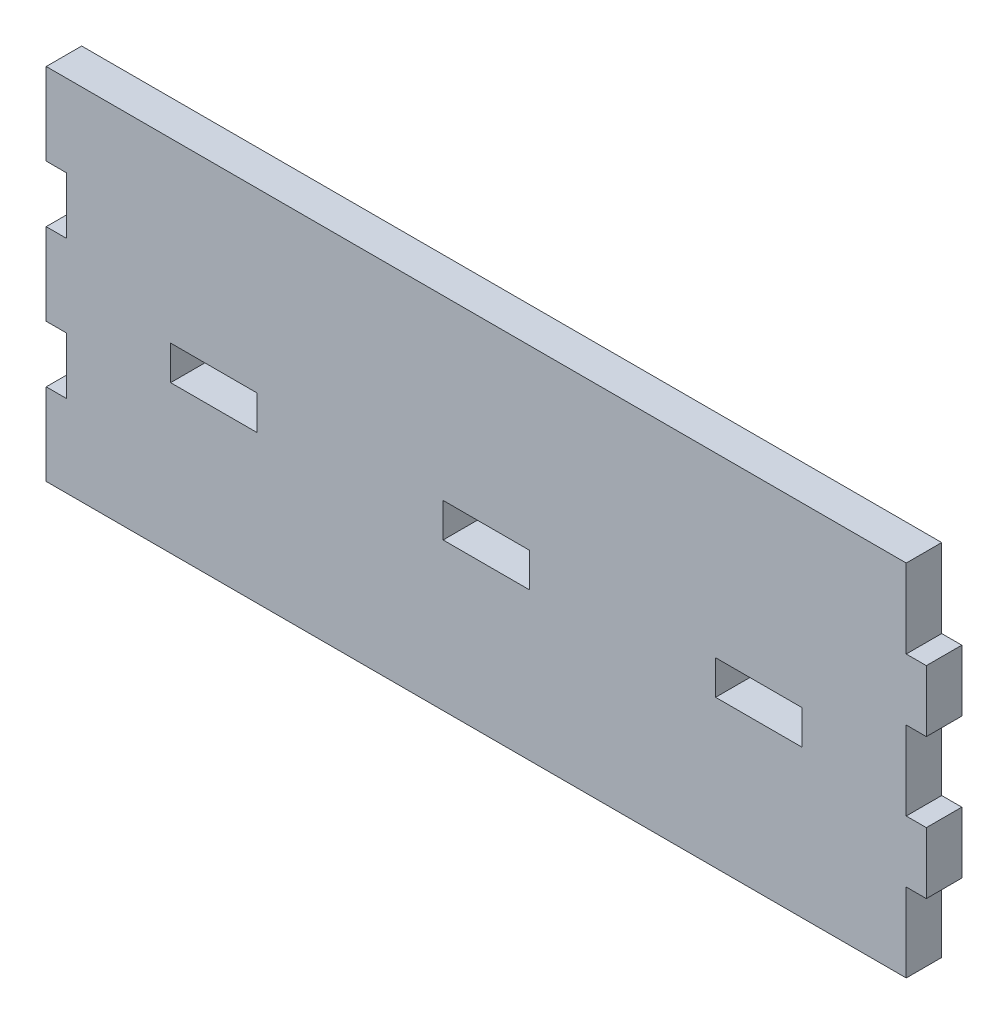
ISO-10303-21;
HEADER;
FILE_DESCRIPTION(('STEP AP214'),'2;1');
FILE_NAME('part.step','',(''),(''),'','','');
FILE_SCHEMA(('AUTOMOTIVE_DESIGN { 1 0 10303 214 1 1 1 1 }'));
ENDSEC;
DATA;
#1=APPLICATION_CONTEXT('core data for automotive mechanical design processes');
#2=APPLICATION_PROTOCOL_DEFINITION('international standard','automotive_design',2000,#1);
#3=PRODUCT_CONTEXT('',#1,'mechanical');
#4=PRODUCT('Part','Part','',(#3));
#5=PRODUCT_RELATED_PRODUCT_CATEGORY('part','',(#4));
#6=PRODUCT_DEFINITION_FORMATION('','',#4);
#7=PRODUCT_DEFINITION_CONTEXT('part definition',#1,'design');
#8=PRODUCT_DEFINITION('design','',#6,#7);
#9=PRODUCT_DEFINITION_SHAPE('','',#8);
#10=(LENGTH_UNIT() NAMED_UNIT(*) SI_UNIT(.MILLI.,.METRE.));
#11=(NAMED_UNIT(*) PLANE_ANGLE_UNIT() SI_UNIT($,.RADIAN.));
#12=(NAMED_UNIT(*) SI_UNIT($,.STERADIAN.) SOLID_ANGLE_UNIT());
#13=UNCERTAINTY_MEASURE_WITH_UNIT(LENGTH_MEASURE(1.E-05),#10,'distance_accuracy_value','');
#14=(GEOMETRIC_REPRESENTATION_CONTEXT(3) GLOBAL_UNCERTAINTY_ASSIGNED_CONTEXT((#13)) GLOBAL_UNIT_ASSIGNED_CONTEXT((#10,
#11,#12)) REPRESENTATION_CONTEXT('',''));
#15=CARTESIAN_POINT('',(0.,0.,0.));
#16=DIRECTION('',(0.,0.,1.));
#17=DIRECTION('',(1.,0.,0.));
#18=AXIS2_PLACEMENT_3D('',#15,#16,#17);
#19=CARTESIAN_POINT('',(0.,0.,6.));
#20=DIRECTION('',(0.,0.,-1.));
#21=DIRECTION('',(-1.,0.,0.));
#22=AXIS2_PLACEMENT_3D('',#19,#20,#21);
#23=PLANE('',#22);
#24=DIRECTION('',(-1.,0.,0.));
#25=VECTOR('',#24,1.);
#26=CARTESIAN_POINT('',(-7.30000000000016,0.399999999999387,6.));
#27=LINE('',#26,#25);
#28=CARTESIAN_POINT('',(7.29999999999983,0.399999999999539,6.));
#29=VERTEX_POINT('',#28);
#30=CARTESIAN_POINT('',(-7.30000000000016,0.399999999999387,6.));
#31=VERTEX_POINT('',#30);
#32=EDGE_CURVE('E287',#29,#31,#27,.T.);
#33=ORIENTED_EDGE('',*,*,#32,.F.);
#34=DIRECTION('',(0.,1.,0.));
#35=VECTOR('',#34,1.);
#36=CARTESIAN_POINT('',(7.29999999999983,0.399999999999539,6.));
#37=LINE('',#36,#35);
#38=CARTESIAN_POINT('',(7.2999999999999,-5.40000000000046,6.));
#39=VERTEX_POINT('',#38);
#40=EDGE_CURVE('E295',#39,#29,#37,.T.);
#41=ORIENTED_EDGE('',*,*,#40,.F.);
#42=DIRECTION('',(1.,0.,0.));
#43=VECTOR('',#42,1.);
#44=CARTESIAN_POINT('',(-7.3000000000001,-5.40000000000061,6.));
#45=LINE('',#44,#43);
#46=CARTESIAN_POINT('',(-7.3000000000001,-5.40000000000061,6.));
#47=VERTEX_POINT('',#46);
#48=EDGE_CURVE('E292',#47,#39,#45,.T.);
#49=ORIENTED_EDGE('',*,*,#48,.F.);
#50=DIRECTION('',(0.,-1.,0.));
#51=VECTOR('',#50,1.);
#52=CARTESIAN_POINT('',(-7.30000000000016,0.399999999999387,6.));
#53=LINE('',#52,#51);
#54=EDGE_CURVE('E289',#31,#47,#53,.T.);
#55=ORIENTED_EDGE('',*,*,#54,.F.);
#56=EDGE_LOOP('',(#33,#41,#49,#55));
#57=FACE_BOUND('',#56,.T.);
#58=DIRECTION('',(0.,1.,0.));
#59=VECTOR('',#58,1.);
#60=CARTESIAN_POINT('',(71.0499999999998,17.0666666666672,6.));
#61=LINE('',#60,#59);
#62=CARTESIAN_POINT('',(71.0499999999998,17.0666666666672,6.));
#63=VERTEX_POINT('',#62);
#64=CARTESIAN_POINT('',(71.0499999999997,30.4,6.));
#65=VERTEX_POINT('',#64);
#66=EDGE_CURVE('E349',#63,#65,#61,.T.);
#67=ORIENTED_EDGE('',*,*,#66,.T.);
#68=DIRECTION('',(-1.,0.,0.));
#69=VECTOR('',#68,1.);
#70=CARTESIAN_POINT('',(-71.0500000000003,30.3999999999993,6.));
#71=LINE('',#70,#69);
#72=CARTESIAN_POINT('',(-74.4500000000002,30.3999999999985,6.));
#73=VERTEX_POINT('',#72);
#74=EDGE_CURVE('E352',#65,#73,#71,.T.);
#75=ORIENTED_EDGE('',*,*,#74,.T.);
#76=DIRECTION('',(0.,-1.,0.));
#77=VECTOR('',#76,1.);
#78=CARTESIAN_POINT('',(-74.4500000000002,30.3999999999985,6.));
#79=LINE('',#78,#77);
#80=CARTESIAN_POINT('',(-74.4500000000002,16.5333333333323,6.));
#81=VERTEX_POINT('',#80);
#82=EDGE_CURVE('E355',#73,#81,#79,.T.);
#83=ORIENTED_EDGE('',*,*,#82,.T.);
#84=DIRECTION('',(1.,0.,0.));
#85=VECTOR('',#84,1.);
#86=CARTESIAN_POINT('',(-71.0500000000002,16.5333333333323,6.));
#87=LINE('',#86,#85);
#88=CARTESIAN_POINT('',(-71.0500000000002,16.5333333333323,6.));
#89=VERTEX_POINT('',#88);
#90=EDGE_CURVE('E357',#81,#89,#87,.T.);
#91=ORIENTED_EDGE('',*,*,#90,.T.);
#92=DIRECTION('',(0.,-1.,0.));
#93=VECTOR('',#92,1.);
#94=CARTESIAN_POINT('',(-71.0500000000001,6.9333333333326,6.));
#95=LINE('',#94,#93);
#96=CARTESIAN_POINT('',(-71.0500000000001,6.9333333333326,6.));
#97=VERTEX_POINT('',#96);
#98=EDGE_CURVE('E359',#89,#97,#95,.T.);
#99=ORIENTED_EDGE('',*,*,#98,.T.);
#100=DIRECTION('',(-1.,0.,0.));
#101=VECTOR('',#100,1.);
#102=CARTESIAN_POINT('',(-71.0500000000001,6.9333333333326,6.));
#103=LINE('',#102,#101);
#104=CARTESIAN_POINT('',(-74.4499999999999,6.93333333333231,6.));
#105=VERTEX_POINT('',#104);
#106=EDGE_CURVE('E361',#97,#105,#103,.T.);
#107=ORIENTED_EDGE('',*,*,#106,.T.);
#108=DIRECTION('',(0.,-1.,0.));
#109=VECTOR('',#108,1.);
#110=CARTESIAN_POINT('',(-74.4499999999999,6.93333333333231,6.));
#111=LINE('',#110,#109);
#112=CARTESIAN_POINT('',(-74.4499999999999,-6.93333333333387,6.));
#113=VERTEX_POINT('',#112);
#114=EDGE_CURVE('E363',#105,#113,#111,.T.);
#115=ORIENTED_EDGE('',*,*,#114,.T.);
#116=DIRECTION('',(1.,0.,0.));
#117=VECTOR('',#116,1.);
#118=CARTESIAN_POINT('',(-71.0499999999999,-6.93333333333384,6.));
#119=LINE('',#118,#117);
#120=CARTESIAN_POINT('',(-71.0499999999999,-6.93333333333384,6.));
#121=VERTEX_POINT('',#120);
#122=EDGE_CURVE('E365',#113,#121,#119,.T.);
#123=ORIENTED_EDGE('',*,*,#122,.T.);
#124=DIRECTION('',(0.,-1.,0.));
#125=VECTOR('',#124,1.);
#126=CARTESIAN_POINT('',(-71.0499999999998,-16.5333333333341,6.));
#127=LINE('',#126,#125);
#128=CARTESIAN_POINT('',(-71.0499999999998,-16.5333333333341,6.));
#129=VERTEX_POINT('',#128);
#130=EDGE_CURVE('E367',#121,#129,#127,.T.);
#131=ORIENTED_EDGE('',*,*,#130,.T.);
#132=DIRECTION('',(-1.,0.,0.));
#133=VECTOR('',#132,1.);
#134=CARTESIAN_POINT('',(-71.0499999999998,-16.5333333333341,6.));
#135=LINE('',#134,#133);
#136=CARTESIAN_POINT('',(-74.4499999999997,-16.5333333333339,6.));
#137=VERTEX_POINT('',#136);
#138=EDGE_CURVE('E369',#129,#137,#135,.T.);
#139=ORIENTED_EDGE('',*,*,#138,.T.);
#140=DIRECTION('',(0.,-1.,0.));
#141=VECTOR('',#140,1.);
#142=CARTESIAN_POINT('',(-74.4499999999997,-16.5333333333339,6.));
#143=LINE('',#142,#141);
#144=CARTESIAN_POINT('',(-74.4499999999997,-30.4000000000001,6.));
#145=VERTEX_POINT('',#144);
#146=EDGE_CURVE('E371',#137,#145,#143,.T.);
#147=ORIENTED_EDGE('',*,*,#146,.T.);
#148=DIRECTION('',(1.,0.,0.));
#149=VECTOR('',#148,1.);
#150=CARTESIAN_POINT('',(-71.0499999999997,-30.4,6.));
#151=LINE('',#150,#149);
#152=CARTESIAN_POINT('',(71.0500000000003,-30.3999999999985,6.));
#153=VERTEX_POINT('',#152);
#154=EDGE_CURVE('E373',#145,#153,#151,.T.);
#155=ORIENTED_EDGE('',*,*,#154,.T.);
#156=DIRECTION('',(0.,1.,0.));
#157=VECTOR('',#156,1.);
#158=CARTESIAN_POINT('',(71.0500000000003,-30.3999999999985,6.));
#159=LINE('',#158,#157);
#160=CARTESIAN_POINT('',(71.0500000000002,-17.0666666666657,6.));
#161=VERTEX_POINT('',#160);
#162=EDGE_CURVE('E375',#153,#161,#159,.T.);
#163=ORIENTED_EDGE('',*,*,#162,.T.);
#164=DIRECTION('',(1.,0.,0.));
#165=VECTOR('',#164,1.);
#166=CARTESIAN_POINT('',(71.0500000000002,-17.0666666666657,6.));
#167=LINE('',#166,#165);
#168=CARTESIAN_POINT('',(74.4500000000001,-17.0666666666656,6.));
#169=VERTEX_POINT('',#168);
#170=EDGE_CURVE('E377',#161,#169,#167,.T.);
#171=ORIENTED_EDGE('',*,*,#170,.T.);
#172=DIRECTION('',(0.,1.,0.));
#173=VECTOR('',#172,1.);
#174=CARTESIAN_POINT('',(74.45,-6.66666666666565,6.));
#175=LINE('',#174,#173);
#176=CARTESIAN_POINT('',(74.45,-6.66666666666565,6.));
#177=VERTEX_POINT('',#176);
#178=EDGE_CURVE('E379',#169,#177,#175,.T.);
#179=ORIENTED_EDGE('',*,*,#178,.T.);
#180=DIRECTION('',(-1.,0.,0.));
#181=VECTOR('',#180,1.);
#182=CARTESIAN_POINT('',(71.0500000000001,-6.66666666666569,6.));
#183=LINE('',#182,#181);
#184=CARTESIAN_POINT('',(71.0500000000001,-6.66666666666569,6.));
#185=VERTEX_POINT('',#184);
#186=EDGE_CURVE('E381',#177,#185,#183,.T.);
#187=ORIENTED_EDGE('',*,*,#186,.T.);
#188=DIRECTION('',(0.,1.,0.));
#189=VECTOR('',#188,1.);
#190=CARTESIAN_POINT('',(71.0500000000001,-6.66666666666569,6.));
#191=LINE('',#190,#189);
#192=CARTESIAN_POINT('',(71.0499999999999,6.66666666666716,6.));
#193=VERTEX_POINT('',#192);
#194=EDGE_CURVE('E383',#185,#193,#191,.T.);
#195=ORIENTED_EDGE('',*,*,#194,.T.);
#196=DIRECTION('',(1.,0.,0.));
#197=VECTOR('',#196,1.);
#198=CARTESIAN_POINT('',(71.0499999999999,6.66666666666716,6.));
#199=LINE('',#198,#197);
#200=CARTESIAN_POINT('',(74.4499999999998,6.6666666666672,6.));
#201=VERTEX_POINT('',#200);
#202=EDGE_CURVE('E385',#193,#201,#199,.T.);
#203=ORIENTED_EDGE('',*,*,#202,.T.);
#204=DIRECTION('',(0.,1.,0.));
#205=VECTOR('',#204,1.);
#206=CARTESIAN_POINT('',(74.4499999999996,17.0666666666672,6.));
#207=LINE('',#206,#205);
#208=CARTESIAN_POINT('',(74.4499999999996,17.0666666666672,6.));
#209=VERTEX_POINT('',#208);
#210=EDGE_CURVE('E387',#201,#209,#207,.T.);
#211=ORIENTED_EDGE('',*,*,#210,.T.);
#212=DIRECTION('',(-1.,0.,0.));
#213=VECTOR('',#212,1.);
#214=CARTESIAN_POINT('',(71.0499999999998,17.0666666666672,6.));
#215=LINE('',#214,#213);
#216=EDGE_CURVE('E389',#209,#63,#215,.T.);
#217=ORIENTED_EDGE('',*,*,#216,.T.);
#218=EDGE_LOOP('',(#67,#75,#83,#91,#99,#107,#115,#123,#131,#139,#147,#155,#163,#171,#179,#187,
#195,#203,#211,#217));
#219=FACE_BOUND('',#218,.T.);
#220=DIRECTION('',(0.,-1.,0.));
#221=VECTOR('',#220,1.);
#222=CARTESIAN_POINT('',(-53.3999999999997,0.399999999998715,6.));
#223=LINE('',#222,#221);
#224=CARTESIAN_POINT('',(-53.3999999999997,0.399999999998715,6.));
#225=VERTEX_POINT('',#224);
#226=CARTESIAN_POINT('',(-53.3999999999997,-5.40000000000128,6.));
#227=VERTEX_POINT('',#226);
#228=EDGE_CURVE('E318',#225,#227,#223,.T.);
#229=ORIENTED_EDGE('',*,*,#228,.F.);
#230=DIRECTION('',(-1.,0.,0.));
#231=VECTOR('',#230,1.);
#232=CARTESIAN_POINT('',(-53.3999999999997,0.399999999998715,6.));
#233=LINE('',#232,#231);
#234=CARTESIAN_POINT('',(-38.7999999999997,0.399999999998868,6.));
#235=VERTEX_POINT('',#234);
#236=EDGE_CURVE('E326',#235,#225,#233,.T.);
#237=ORIENTED_EDGE('',*,*,#236,.F.);
#238=DIRECTION('',(0.,1.,0.));
#239=VECTOR('',#238,1.);
#240=CARTESIAN_POINT('',(-38.7999999999997,0.399999999998868,6.));
#241=LINE('',#240,#239);
#242=CARTESIAN_POINT('',(-38.7999999999997,-5.40000000000113,6.));
#243=VERTEX_POINT('',#242);
#244=EDGE_CURVE('E323',#243,#235,#241,.T.);
#245=ORIENTED_EDGE('',*,*,#244,.F.);
#246=DIRECTION('',(1.,0.,0.));
#247=VECTOR('',#246,1.);
#248=CARTESIAN_POINT('',(-53.3999999999997,-5.40000000000128,6.));
#249=LINE('',#248,#247);
#250=EDGE_CURVE('E320',#227,#243,#249,.T.);
#251=ORIENTED_EDGE('',*,*,#250,.F.);
#252=EDGE_LOOP('',(#229,#237,#245,#251));
#253=FACE_BOUND('',#252,.T.);
#254=DIRECTION('',(-1.,0.,0.));
#255=VECTOR('',#254,1.);
#256=CARTESIAN_POINT('',(38.8,0.399999999999436,6.));
#257=LINE('',#256,#255);
#258=CARTESIAN_POINT('',(53.3999999999997,0.399999999999828,6.));
#259=VERTEX_POINT('',#258);
#260=CARTESIAN_POINT('',(38.8,0.399999999999436,6.));
#261=VERTEX_POINT('',#260);
#262=EDGE_CURVE('E251',#259,#261,#257,.T.);
#263=ORIENTED_EDGE('',*,*,#262,.F.);
#264=DIRECTION('',(0.,1.,0.));
#265=VECTOR('',#264,1.);
#266=CARTESIAN_POINT('',(53.3999999999997,0.399999999999828,6.));
#267=LINE('',#266,#265);
#268=CARTESIAN_POINT('',(53.4,-5.40000000000041,6.));
#269=VERTEX_POINT('',#268);
#270=EDGE_CURVE('E273',#269,#259,#267,.T.);
#271=ORIENTED_EDGE('',*,*,#270,.F.);
#272=DIRECTION('',(1.,0.,0.));
#273=VECTOR('',#272,1.);
#274=CARTESIAN_POINT('',(38.8,-5.40000000000056,6.));
#275=LINE('',#274,#273);
#276=CARTESIAN_POINT('',(38.8,-5.40000000000056,6.));
#277=VERTEX_POINT('',#276);
#278=EDGE_CURVE('E271',#277,#269,#275,.T.);
#279=ORIENTED_EDGE('',*,*,#278,.F.);
#280=DIRECTION('',(0.,-1.,0.));
#281=VECTOR('',#280,1.);
#282=CARTESIAN_POINT('',(38.8,0.399999999999436,6.));
#283=LINE('',#282,#281);
#284=EDGE_CURVE('E259',#261,#277,#283,.T.);
#285=ORIENTED_EDGE('',*,*,#284,.F.);
#286=EDGE_LOOP('',(#263,#271,#279,#285));
#287=FACE_BOUND('',#286,.T.);
#288=ADVANCED_FACE('F42',(#57,#219,#253,#287),#23,.F.);
#289=CARTESIAN_POINT('',(0.,0.,0.));
#290=DIRECTION('',(0.,0.,-1.));
#291=DIRECTION('',(-1.,0.,0.));
#292=AXIS2_PLACEMENT_3D('',#289,#290,#291);
#293=PLANE('',#292);
#294=DIRECTION('',(0.,1.,0.));
#295=VECTOR('',#294,1.);
#296=CARTESIAN_POINT('',(71.0499999999998,17.0666666666672,0.));
#297=LINE('',#296,#295);
#298=CARTESIAN_POINT('',(71.0499999999998,17.0666666666672,0.));
#299=VERTEX_POINT('',#298);
#300=CARTESIAN_POINT('',(71.0499999999997,30.4,0.));
#301=VERTEX_POINT('',#300);
#302=EDGE_CURVE('E348',#299,#301,#297,.T.);
#303=ORIENTED_EDGE('',*,*,#302,.F.);
#304=DIRECTION('',(-1.,0.,0.));
#305=VECTOR('',#304,1.);
#306=CARTESIAN_POINT('',(71.0499999999998,17.0666666666672,0.));
#307=LINE('',#306,#305);
#308=CARTESIAN_POINT('',(74.4499999999996,17.0666666666672,0.));
#309=VERTEX_POINT('',#308);
#310=EDGE_CURVE('E353',#309,#299,#307,.T.);
#311=ORIENTED_EDGE('',*,*,#310,.F.);
#312=DIRECTION('',(0.,1.,0.));
#313=VECTOR('',#312,1.);
#314=CARTESIAN_POINT('',(74.4499999999996,17.0666666666672,0.));
#315=LINE('',#314,#313);
#316=CARTESIAN_POINT('',(74.4499999999998,6.6666666666672,0.));
#317=VERTEX_POINT('',#316);
#318=EDGE_CURVE('E429',#317,#309,#315,.T.);
#319=ORIENTED_EDGE('',*,*,#318,.F.);
#320=DIRECTION('',(1.,0.,0.));
#321=VECTOR('',#320,1.);
#322=CARTESIAN_POINT('',(71.0499999999999,6.66666666666716,0.));
#323=LINE('',#322,#321);
#324=CARTESIAN_POINT('',(71.0499999999999,6.66666666666716,0.));
#325=VERTEX_POINT('',#324);
#326=EDGE_CURVE('E427',#325,#317,#323,.T.);
#327=ORIENTED_EDGE('',*,*,#326,.F.);
#328=DIRECTION('',(0.,1.,0.));
#329=VECTOR('',#328,1.);
#330=CARTESIAN_POINT('',(71.0500000000001,-6.66666666666569,0.));
#331=LINE('',#330,#329);
#332=CARTESIAN_POINT('',(71.0500000000001,-6.66666666666569,0.));
#333=VERTEX_POINT('',#332);
#334=EDGE_CURVE('E425',#333,#325,#331,.T.);
#335=ORIENTED_EDGE('',*,*,#334,.F.);
#336=DIRECTION('',(-1.,0.,0.));
#337=VECTOR('',#336,1.);
#338=CARTESIAN_POINT('',(71.0500000000001,-6.66666666666569,0.));
#339=LINE('',#338,#337);
#340=CARTESIAN_POINT('',(74.45,-6.66666666666565,0.));
#341=VERTEX_POINT('',#340);
#342=EDGE_CURVE('E423',#341,#333,#339,.T.);
#343=ORIENTED_EDGE('',*,*,#342,.F.);
#344=DIRECTION('',(0.,1.,0.));
#345=VECTOR('',#344,1.);
#346=CARTESIAN_POINT('',(74.45,-6.66666666666565,0.));
#347=LINE('',#346,#345);
#348=CARTESIAN_POINT('',(74.4500000000001,-17.0666666666656,0.));
#349=VERTEX_POINT('',#348);
#350=EDGE_CURVE('E421',#349,#341,#347,.T.);
#351=ORIENTED_EDGE('',*,*,#350,.F.);
#352=DIRECTION('',(1.,0.,0.));
#353=VECTOR('',#352,1.);
#354=CARTESIAN_POINT('',(71.0500000000002,-17.0666666666657,0.));
#355=LINE('',#354,#353);
#356=CARTESIAN_POINT('',(71.0500000000002,-17.0666666666657,0.));
#357=VERTEX_POINT('',#356);
#358=EDGE_CURVE('E419',#357,#349,#355,.T.);
#359=ORIENTED_EDGE('',*,*,#358,.F.);
#360=DIRECTION('',(0.,1.,0.));
#361=VECTOR('',#360,1.);
#362=CARTESIAN_POINT('',(71.0500000000003,-30.3999999999985,0.));
#363=LINE('',#362,#361);
#364=CARTESIAN_POINT('',(71.0500000000003,-30.3999999999985,0.));
#365=VERTEX_POINT('',#364);
#366=EDGE_CURVE('E417',#365,#357,#363,.T.);
#367=ORIENTED_EDGE('',*,*,#366,.F.);
#368=DIRECTION('',(1.,0.,0.));
#369=VECTOR('',#368,1.);
#370=CARTESIAN_POINT('',(-71.0499999999997,-30.4,0.));
#371=LINE('',#370,#369);
#372=CARTESIAN_POINT('',(-74.4499999999997,-30.4000000000001,0.));
#373=VERTEX_POINT('',#372);
#374=EDGE_CURVE('E415',#373,#365,#371,.T.);
#375=ORIENTED_EDGE('',*,*,#374,.F.);
#376=DIRECTION('',(0.,-1.,0.));
#377=VECTOR('',#376,1.);
#378=CARTESIAN_POINT('',(-74.4499999999997,-16.5333333333339,0.));
#379=LINE('',#378,#377);
#380=CARTESIAN_POINT('',(-74.4499999999997,-16.5333333333339,0.));
#381=VERTEX_POINT('',#380);
#382=EDGE_CURVE('E412',#381,#373,#379,.T.);
#383=ORIENTED_EDGE('',*,*,#382,.F.);
#384=DIRECTION('',(-1.,0.,0.));
#385=VECTOR('',#384,1.);
#386=CARTESIAN_POINT('',(-71.0499999999998,-16.5333333333341,0.));
#387=LINE('',#386,#385);
#388=CARTESIAN_POINT('',(-71.0499999999998,-16.5333333333341,0.));
#389=VERTEX_POINT('',#388);
#390=EDGE_CURVE('E410',#389,#381,#387,.T.);
#391=ORIENTED_EDGE('',*,*,#390,.F.);
#392=DIRECTION('',(0.,-1.,0.));
#393=VECTOR('',#392,1.);
#394=CARTESIAN_POINT('',(-71.0499999999998,-16.5333333333341,0.));
#395=LINE('',#394,#393);
#396=CARTESIAN_POINT('',(-71.0499999999999,-6.93333333333384,0.));
#397=VERTEX_POINT('',#396);
#398=EDGE_CURVE('E408',#397,#389,#395,.T.);
#399=ORIENTED_EDGE('',*,*,#398,.F.);
#400=DIRECTION('',(1.,0.,0.));
#401=VECTOR('',#400,1.);
#402=CARTESIAN_POINT('',(-71.0499999999999,-6.93333333333384,0.));
#403=LINE('',#402,#401);
#404=CARTESIAN_POINT('',(-74.4499999999999,-6.93333333333387,0.));
#405=VERTEX_POINT('',#404);
#406=EDGE_CURVE('E406',#405,#397,#403,.T.);
#407=ORIENTED_EDGE('',*,*,#406,.F.);
#408=DIRECTION('',(0.,-1.,0.));
#409=VECTOR('',#408,1.);
#410=CARTESIAN_POINT('',(-74.4499999999999,6.93333333333231,0.));
#411=LINE('',#410,#409);
#412=CARTESIAN_POINT('',(-74.4499999999999,6.93333333333231,0.));
#413=VERTEX_POINT('',#412);
#414=EDGE_CURVE('E404',#413,#405,#411,.T.);
#415=ORIENTED_EDGE('',*,*,#414,.F.);
#416=DIRECTION('',(-1.,0.,0.));
#417=VECTOR('',#416,1.);
#418=CARTESIAN_POINT('',(-71.0500000000001,6.9333333333326,0.));
#419=LINE('',#418,#417);
#420=CARTESIAN_POINT('',(-71.0500000000001,6.9333333333326,0.));
#421=VERTEX_POINT('',#420);
#422=EDGE_CURVE('E402',#421,#413,#419,.T.);
#423=ORIENTED_EDGE('',*,*,#422,.F.);
#424=DIRECTION('',(0.,-1.,0.));
#425=VECTOR('',#424,1.);
#426=CARTESIAN_POINT('',(-71.0500000000001,6.9333333333326,0.));
#427=LINE('',#426,#425);
#428=CARTESIAN_POINT('',(-71.0500000000002,16.5333333333323,0.));
#429=VERTEX_POINT('',#428);
#430=EDGE_CURVE('E400',#429,#421,#427,.T.);
#431=ORIENTED_EDGE('',*,*,#430,.F.);
#432=DIRECTION('',(1.,0.,0.));
#433=VECTOR('',#432,1.);
#434=CARTESIAN_POINT('',(-71.0500000000002,16.5333333333323,0.));
#435=LINE('',#434,#433);
#436=CARTESIAN_POINT('',(-74.4500000000002,16.5333333333323,0.));
#437=VERTEX_POINT('',#436);
#438=EDGE_CURVE('E398',#437,#429,#435,.T.);
#439=ORIENTED_EDGE('',*,*,#438,.F.);
#440=DIRECTION('',(0.,-1.,0.));
#441=VECTOR('',#440,1.);
#442=CARTESIAN_POINT('',(-74.4500000000002,30.3999999999985,0.));
#443=LINE('',#442,#441);
#444=CARTESIAN_POINT('',(-74.4500000000002,30.3999999999985,0.));
#445=VERTEX_POINT('',#444);
#446=EDGE_CURVE('E396',#445,#437,#443,.T.);
#447=ORIENTED_EDGE('',*,*,#446,.F.);
#448=DIRECTION('',(-1.,-2.26534477451097E-13,0.));
#449=VECTOR('',#448,1.);
#450=CARTESIAN_POINT('',(-71.0500000000003,30.3999999999993,0.));
#451=LINE('',#450,#449);
#452=EDGE_CURVE('E394',#301,#445,#451,.T.);
#453=ORIENTED_EDGE('',*,*,#452,.F.);
#454=EDGE_LOOP('',(#303,#311,#319,#327,#335,#343,#351,#359,#367,#375,#383,#391,#399,#407,#415,
#423,#431,#439,#447,#453));
#455=FACE_BOUND('',#454,.T.);
#456=DIRECTION('',(-1.,0.,0.));
#457=VECTOR('',#456,1.);
#458=CARTESIAN_POINT('',(-53.3999999999997,0.399999999998715,0.));
#459=LINE('',#458,#457);
#460=CARTESIAN_POINT('',(-38.7999999999997,0.399999999998868,0.));
#461=VERTEX_POINT('',#460);
#462=CARTESIAN_POINT('',(-53.3999999999997,0.399999999998715,0.));
#463=VERTEX_POINT('',#462);
#464=EDGE_CURVE('E321',#461,#463,#459,.T.);
#465=ORIENTED_EDGE('',*,*,#464,.T.);
#466=DIRECTION('',(0.,-1.,0.));
#467=VECTOR('',#466,1.);
#468=CARTESIAN_POINT('',(-53.3999999999997,0.399999999998715,0.));
#469=LINE('',#468,#467);
#470=CARTESIAN_POINT('',(-53.3999999999997,-5.40000000000128,0.));
#471=VERTEX_POINT('',#470);
#472=EDGE_CURVE('E317',#463,#471,#469,.T.);
#473=ORIENTED_EDGE('',*,*,#472,.T.);
#474=DIRECTION('',(1.,0.,0.));
#475=VECTOR('',#474,1.);
#476=CARTESIAN_POINT('',(-53.3999999999997,-5.40000000000128,0.));
#477=LINE('',#476,#475);
#478=CARTESIAN_POINT('',(-38.7999999999997,-5.40000000000113,0.));
#479=VERTEX_POINT('',#478);
#480=EDGE_CURVE('E331',#471,#479,#477,.T.);
#481=ORIENTED_EDGE('',*,*,#480,.T.);
#482=DIRECTION('',(0.,1.,0.));
#483=VECTOR('',#482,1.);
#484=CARTESIAN_POINT('',(-38.7999999999997,0.399999999998868,0.));
#485=LINE('',#484,#483);
#486=EDGE_CURVE('E334',#479,#461,#485,.T.);
#487=ORIENTED_EDGE('',*,*,#486,.T.);
#488=EDGE_LOOP('',(#465,#473,#481,#487));
#489=FACE_BOUND('',#488,.T.);
#490=DIRECTION('',(0.,1.,0.));
#491=VECTOR('',#490,1.);
#492=CARTESIAN_POINT('',(7.29999999999983,0.399999999999539,0.));
#493=LINE('',#492,#491);
#494=CARTESIAN_POINT('',(7.2999999999999,-5.40000000000046,0.));
#495=VERTEX_POINT('',#494);
#496=CARTESIAN_POINT('',(7.29999999999983,0.399999999999539,0.));
#497=VERTEX_POINT('',#496);
#498=EDGE_CURVE('E290',#495,#497,#493,.T.);
#499=ORIENTED_EDGE('',*,*,#498,.T.);
#500=DIRECTION('',(-1.,0.,0.));
#501=VECTOR('',#500,1.);
#502=CARTESIAN_POINT('',(-7.30000000000016,0.399999999999387,0.));
#503=LINE('',#502,#501);
#504=CARTESIAN_POINT('',(-7.30000000000016,0.399999999999387,0.));
#505=VERTEX_POINT('',#504);
#506=EDGE_CURVE('E267',#497,#505,#503,.T.);
#507=ORIENTED_EDGE('',*,*,#506,.T.);
#508=DIRECTION('',(0.,-1.,0.));
#509=VECTOR('',#508,1.);
#510=CARTESIAN_POINT('',(-7.30000000000016,0.399999999999387,0.));
#511=LINE('',#510,#509);
#512=CARTESIAN_POINT('',(-7.3000000000001,-5.40000000000061,0.));
#513=VERTEX_POINT('',#512);
#514=EDGE_CURVE('E300',#505,#513,#511,.T.);
#515=ORIENTED_EDGE('',*,*,#514,.T.);
#516=DIRECTION('',(1.,0.,0.));
#517=VECTOR('',#516,1.);
#518=CARTESIAN_POINT('',(-7.3000000000001,-5.40000000000061,0.));
#519=LINE('',#518,#517);
#520=EDGE_CURVE('E303',#513,#495,#519,.T.);
#521=ORIENTED_EDGE('',*,*,#520,.T.);
#522=EDGE_LOOP('',(#499,#507,#515,#521));
#523=FACE_BOUND('',#522,.T.);
#524=DIRECTION('',(0.,1.,0.));
#525=VECTOR('',#524,1.);
#526=CARTESIAN_POINT('',(53.3999999999997,0.399999999999828,0.));
#527=LINE('',#526,#525);
#528=CARTESIAN_POINT('',(53.4,-5.40000000000041,0.));
#529=VERTEX_POINT('',#528);
#530=CARTESIAN_POINT('',(53.3999999999997,0.399999999999828,0.));
#531=VERTEX_POINT('',#530);
#532=EDGE_CURVE('E260',#529,#531,#527,.T.);
#533=ORIENTED_EDGE('',*,*,#532,.T.);
#534=DIRECTION('',(-1.,0.,0.));
#535=VECTOR('',#534,1.);
#536=CARTESIAN_POINT('',(38.8,0.399999999999436,0.));
#537=LINE('',#536,#535);
#538=CARTESIAN_POINT('',(38.8,0.399999999999436,0.));
#539=VERTEX_POINT('',#538);
#540=EDGE_CURVE('E65',#531,#539,#537,.T.);
#541=ORIENTED_EDGE('',*,*,#540,.T.);
#542=DIRECTION('',(0.,-1.,0.));
#543=VECTOR('',#542,1.);
#544=CARTESIAN_POINT('',(38.8,0.399999999999436,0.));
#545=LINE('',#544,#543);
#546=CARTESIAN_POINT('',(38.8,-5.40000000000056,0.));
#547=VERTEX_POINT('',#546);
#548=EDGE_CURVE('E266',#539,#547,#545,.T.);
#549=ORIENTED_EDGE('',*,*,#548,.T.);
#550=DIRECTION('',(1.,0.,0.));
#551=VECTOR('',#550,1.);
#552=CARTESIAN_POINT('',(38.8,-5.40000000000056,0.));
#553=LINE('',#552,#551);
#554=EDGE_CURVE('E279',#547,#529,#553,.T.);
#555=ORIENTED_EDGE('',*,*,#554,.T.);
#556=EDGE_LOOP('',(#533,#541,#549,#555));
#557=FACE_BOUND('',#556,.T.);
#558=ADVANCED_FACE('F495',(#455,#489,#523,#557),#293,.T.);
#559=CARTESIAN_POINT('',(71.0499999999998,17.0666666666672,6.));
#560=DIRECTION('',(-1.,0.,0.));
#561=DIRECTION('',(0.,-1.,0.));
#562=AXIS2_PLACEMENT_3D('',#559,#560,#561);
#563=PLANE('',#562);
#564=ORIENTED_EDGE('',*,*,#302,.T.);
#565=DIRECTION('',(0.,0.,-1.));
#566=VECTOR('',#565,1.);
#567=CARTESIAN_POINT('',(71.0499999999997,30.4,6.));
#568=LINE('',#567,#566);
#569=EDGE_CURVE('E11',#65,#301,#568,.T.);
#570=ORIENTED_EDGE('',*,*,#569,.F.);
#571=ORIENTED_EDGE('',*,*,#66,.F.);
#572=DIRECTION('',(0.,0.,-1.));
#573=VECTOR('',#572,1.);
#574=CARTESIAN_POINT('',(71.0499999999998,17.0666666666672,6.));
#575=LINE('',#574,#573);
#576=EDGE_CURVE('E391',#63,#299,#575,.T.);
#577=ORIENTED_EDGE('',*,*,#576,.T.);
#578=EDGE_LOOP('',(#564,#570,#571,#577));
#579=FACE_BOUND('',#578,.T.);
#580=ADVANCED_FACE('F44',(#579),#563,.F.);
#581=CARTESIAN_POINT('',(-71.0500000000003,30.3999999999993,6.));
#582=DIRECTION('',(2.26534477451097E-13,-1.,0.));
#583=DIRECTION('',(1.,2.26534477451097E-13,0.));
#584=AXIS2_PLACEMENT_3D('',#581,#582,#583);
#585=PLANE('',#584);
#586=ORIENTED_EDGE('',*,*,#452,.T.);
#587=DIRECTION('',(0.,0.,-1.));
#588=VECTOR('',#587,1.);
#589=CARTESIAN_POINT('',(-74.4500000000002,30.3999999999985,6.));
#590=LINE('',#589,#588);
#591=EDGE_CURVE('E50',#73,#445,#590,.T.);
#592=ORIENTED_EDGE('',*,*,#591,.F.);
#593=ORIENTED_EDGE('',*,*,#74,.F.);
#594=ORIENTED_EDGE('',*,*,#569,.T.);
#595=EDGE_LOOP('',(#586,#592,#593,#594));
#596=FACE_BOUND('',#595,.T.);
#597=ADVANCED_FACE('F513',(#596),#585,.F.);
#598=CARTESIAN_POINT('',(-74.4500000000002,30.3999999999985,6.));
#599=DIRECTION('',(1.,0.,0.));
#600=DIRECTION('',(0.,0.,-1.));
#601=AXIS2_PLACEMENT_3D('',#598,#599,#600);
#602=PLANE('',#601);
#603=ORIENTED_EDGE('',*,*,#446,.T.);
#604=DIRECTION('',(0.,0.,-1.));
#605=VECTOR('',#604,1.);
#606=CARTESIAN_POINT('',(-74.4500000000002,16.5333333333323,6.));
#607=LINE('',#606,#605);
#608=EDGE_CURVE('E482',#81,#437,#607,.T.);
#609=ORIENTED_EDGE('',*,*,#608,.F.);
#610=ORIENTED_EDGE('',*,*,#82,.F.);
#611=ORIENTED_EDGE('',*,*,#591,.T.);
#612=EDGE_LOOP('',(#603,#609,#610,#611));
#613=FACE_BOUND('',#612,.T.);
#614=ADVANCED_FACE('F489',(#613),#602,.F.);
#615=CARTESIAN_POINT('',(-71.0500000000002,16.5333333333323,6.));
#616=DIRECTION('',(0.,1.,0.));
#617=DIRECTION('',(-1.,0.,0.));
#618=AXIS2_PLACEMENT_3D('',#615,#616,#617);
#619=PLANE('',#618);
#620=ORIENTED_EDGE('',*,*,#438,.T.);
#621=DIRECTION('',(0.,0.,-1.));
#622=VECTOR('',#621,1.);
#623=CARTESIAN_POINT('',(-71.0500000000002,16.5333333333323,6.));
#624=LINE('',#623,#622);
#625=EDGE_CURVE('E479',#89,#429,#624,.T.);
#626=ORIENTED_EDGE('',*,*,#625,.F.);
#627=ORIENTED_EDGE('',*,*,#90,.F.);
#628=ORIENTED_EDGE('',*,*,#608,.T.);
#629=EDGE_LOOP('',(#620,#626,#627,#628));
#630=FACE_BOUND('',#629,.T.);
#631=ADVANCED_FACE('F501',(#630),#619,.F.);
#632=CARTESIAN_POINT('',(-71.0500000000001,6.9333333333326,6.));
#633=DIRECTION('',(1.,0.,0.));
#634=DIRECTION('',(0.,1.,0.));
#635=AXIS2_PLACEMENT_3D('',#632,#633,#634);
#636=PLANE('',#635);
#637=ORIENTED_EDGE('',*,*,#430,.T.);
#638=DIRECTION('',(0.,0.,-1.));
#639=VECTOR('',#638,1.);
#640=CARTESIAN_POINT('',(-71.0500000000001,6.9333333333326,6.));
#641=LINE('',#640,#639);
#642=EDGE_CURVE('E476',#97,#421,#641,.T.);
#643=ORIENTED_EDGE('',*,*,#642,.F.);
#644=ORIENTED_EDGE('',*,*,#98,.F.);
#645=ORIENTED_EDGE('',*,*,#625,.T.);
#646=EDGE_LOOP('',(#637,#643,#644,#645));
#647=FACE_BOUND('',#646,.T.);
#648=ADVANCED_FACE('F505',(#647),#636,.F.);
#649=CARTESIAN_POINT('',(-71.0500000000001,6.9333333333326,6.));
#650=DIRECTION('',(0.,-1.,0.));
#651=DIRECTION('',(1.,0.,0.));
#652=AXIS2_PLACEMENT_3D('',#649,#650,#651);
#653=PLANE('',#652);
#654=ORIENTED_EDGE('',*,*,#422,.T.);
#655=DIRECTION('',(0.,0.,-1.));
#656=VECTOR('',#655,1.);
#657=CARTESIAN_POINT('',(-74.4499999999999,6.93333333333231,6.));
#658=LINE('',#657,#656);
#659=EDGE_CURVE('E473',#105,#413,#658,.T.);
#660=ORIENTED_EDGE('',*,*,#659,.F.);
#661=ORIENTED_EDGE('',*,*,#106,.F.);
#662=ORIENTED_EDGE('',*,*,#642,.T.);
#663=EDGE_LOOP('',(#654,#660,#661,#662));
#664=FACE_BOUND('',#663,.T.);
#665=ADVANCED_FACE('F585',(#664),#653,.F.);
#666=CARTESIAN_POINT('',(-74.4499999999999,6.93333333333231,6.));
#667=DIRECTION('',(1.,0.,0.));
#668=DIRECTION('',(0.,0.,-1.));
#669=AXIS2_PLACEMENT_3D('',#666,#667,#668);
#670=PLANE('',#669);
#671=ORIENTED_EDGE('',*,*,#414,.T.);
#672=DIRECTION('',(0.,0.,-1.));
#673=VECTOR('',#672,1.);
#674=CARTESIAN_POINT('',(-74.4499999999999,-6.93333333333387,6.));
#675=LINE('',#674,#673);
#676=EDGE_CURVE('E470',#113,#405,#675,.T.);
#677=ORIENTED_EDGE('',*,*,#676,.F.);
#678=ORIENTED_EDGE('',*,*,#114,.F.);
#679=ORIENTED_EDGE('',*,*,#659,.T.);
#680=EDGE_LOOP('',(#671,#677,#678,#679));
#681=FACE_BOUND('',#680,.T.);
#682=ADVANCED_FACE('F583',(#681),#670,.F.);
#683=CARTESIAN_POINT('',(-71.0499999999999,-6.93333333333384,6.));
#684=DIRECTION('',(0.,1.,0.));
#685=DIRECTION('',(-1.,0.,0.));
#686=AXIS2_PLACEMENT_3D('',#683,#684,#685);
#687=PLANE('',#686);
#688=ORIENTED_EDGE('',*,*,#406,.T.);
#689=DIRECTION('',(0.,0.,-1.));
#690=VECTOR('',#689,1.);
#691=CARTESIAN_POINT('',(-71.0499999999999,-6.93333333333384,6.));
#692=LINE('',#691,#690);
#693=EDGE_CURVE('E467',#121,#397,#692,.T.);
#694=ORIENTED_EDGE('',*,*,#693,.F.);
#695=ORIENTED_EDGE('',*,*,#122,.F.);
#696=ORIENTED_EDGE('',*,*,#676,.T.);
#697=EDGE_LOOP('',(#688,#694,#695,#696));
#698=FACE_BOUND('',#697,.T.);
#699=ADVANCED_FACE('F579',(#698),#687,.F.);
#700=CARTESIAN_POINT('',(-71.0499999999998,-16.5333333333341,6.));
#701=DIRECTION('',(1.,0.,0.));
#702=DIRECTION('',(0.,1.,0.));
#703=AXIS2_PLACEMENT_3D('',#700,#701,#702);
#704=PLANE('',#703);
#705=ORIENTED_EDGE('',*,*,#398,.T.);
#706=DIRECTION('',(0.,0.,-1.));
#707=VECTOR('',#706,1.);
#708=CARTESIAN_POINT('',(-71.0499999999998,-16.5333333333341,6.));
#709=LINE('',#708,#707);
#710=EDGE_CURVE('E464',#129,#389,#709,.T.);
#711=ORIENTED_EDGE('',*,*,#710,.F.);
#712=ORIENTED_EDGE('',*,*,#130,.F.);
#713=ORIENTED_EDGE('',*,*,#693,.T.);
#714=EDGE_LOOP('',(#705,#711,#712,#713));
#715=FACE_BOUND('',#714,.T.);
#716=ADVANCED_FACE('F574',(#715),#704,.F.);
#717=CARTESIAN_POINT('',(-71.0499999999998,-16.5333333333341,6.));
#718=DIRECTION('',(0.,-1.,0.));
#719=DIRECTION('',(1.,0.,0.));
#720=AXIS2_PLACEMENT_3D('',#717,#718,#719);
#721=PLANE('',#720);
#722=ORIENTED_EDGE('',*,*,#390,.T.);
#723=DIRECTION('',(0.,0.,-1.));
#724=VECTOR('',#723,1.);
#725=CARTESIAN_POINT('',(-74.4499999999997,-16.5333333333339,6.));
#726=LINE('',#725,#724);
#727=EDGE_CURVE('E461',#137,#381,#726,.T.);
#728=ORIENTED_EDGE('',*,*,#727,.F.);
#729=ORIENTED_EDGE('',*,*,#138,.F.);
#730=ORIENTED_EDGE('',*,*,#710,.T.);
#731=EDGE_LOOP('',(#722,#728,#729,#730));
#732=FACE_BOUND('',#731,.T.);
#733=ADVANCED_FACE('F568',(#732),#721,.F.);
#734=CARTESIAN_POINT('',(-74.4499999999997,-16.5333333333339,6.));
#735=DIRECTION('',(1.,0.,0.));
#736=DIRECTION('',(0.,0.,-1.));
#737=AXIS2_PLACEMENT_3D('',#734,#735,#736);
#738=PLANE('',#737);
#739=ORIENTED_EDGE('',*,*,#382,.T.);
#740=DIRECTION('',(0.,0.,-1.));
#741=VECTOR('',#740,1.);
#742=CARTESIAN_POINT('',(-74.4499999999997,-30.4000000000001,6.));
#743=LINE('',#742,#741);
#744=EDGE_CURVE('E458',#145,#373,#743,.T.);
#745=ORIENTED_EDGE('',*,*,#744,.F.);
#746=ORIENTED_EDGE('',*,*,#146,.F.);
#747=ORIENTED_EDGE('',*,*,#727,.T.);
#748=EDGE_LOOP('',(#739,#745,#746,#747));
#749=FACE_BOUND('',#748,.T.);
#750=ADVANCED_FACE('F563',(#749),#738,.F.);
#751=CARTESIAN_POINT('',(-71.0499999999997,-30.4,6.));
#752=DIRECTION('',(0.,1.,0.));
#753=DIRECTION('',(-1.,0.,0.));
#754=AXIS2_PLACEMENT_3D('',#751,#752,#753);
#755=PLANE('',#754);
#756=ORIENTED_EDGE('',*,*,#374,.T.);
#757=DIRECTION('',(0.,0.,-1.));
#758=VECTOR('',#757,1.);
#759=CARTESIAN_POINT('',(71.0500000000003,-30.3999999999985,6.));
#760=LINE('',#759,#758);
#761=EDGE_CURVE('E455',#153,#365,#760,.T.);
#762=ORIENTED_EDGE('',*,*,#761,.F.);
#763=ORIENTED_EDGE('',*,*,#154,.F.);
#764=ORIENTED_EDGE('',*,*,#744,.T.);
#765=EDGE_LOOP('',(#756,#762,#763,#764));
#766=FACE_BOUND('',#765,.T.);
#767=ADVANCED_FACE('F558',(#766),#755,.F.);
#768=CARTESIAN_POINT('',(71.0500000000003,-30.3999999999985,6.));
#769=DIRECTION('',(-1.,0.,0.));
#770=DIRECTION('',(0.,-1.,0.));
#771=AXIS2_PLACEMENT_3D('',#768,#769,#770);
#772=PLANE('',#771);
#773=ORIENTED_EDGE('',*,*,#366,.T.);
#774=DIRECTION('',(0.,0.,-1.));
#775=VECTOR('',#774,1.);
#776=CARTESIAN_POINT('',(71.0500000000002,-17.0666666666657,6.));
#777=LINE('',#776,#775);
#778=EDGE_CURVE('E452',#161,#357,#777,.T.);
#779=ORIENTED_EDGE('',*,*,#778,.F.);
#780=ORIENTED_EDGE('',*,*,#162,.F.);
#781=ORIENTED_EDGE('',*,*,#761,.T.);
#782=EDGE_LOOP('',(#773,#779,#780,#781));
#783=FACE_BOUND('',#782,.T.);
#784=ADVANCED_FACE('F554',(#783),#772,.F.);
#785=CARTESIAN_POINT('',(71.0500000000002,-17.0666666666657,6.));
#786=DIRECTION('',(0.,1.,0.));
#787=DIRECTION('',(-1.,0.,0.));
#788=AXIS2_PLACEMENT_3D('',#785,#786,#787);
#789=PLANE('',#788);
#790=ORIENTED_EDGE('',*,*,#358,.T.);
#791=DIRECTION('',(0.,0.,-1.));
#792=VECTOR('',#791,1.);
#793=CARTESIAN_POINT('',(74.4500000000001,-17.0666666666656,6.));
#794=LINE('',#793,#792);
#795=EDGE_CURVE('E449',#169,#349,#794,.T.);
#796=ORIENTED_EDGE('',*,*,#795,.F.);
#797=ORIENTED_EDGE('',*,*,#170,.F.);
#798=ORIENTED_EDGE('',*,*,#778,.T.);
#799=EDGE_LOOP('',(#790,#796,#797,#798));
#800=FACE_BOUND('',#799,.T.);
#801=ADVANCED_FACE('F549',(#800),#789,.F.);
#802=CARTESIAN_POINT('',(74.45,-6.66666666666565,6.));
#803=DIRECTION('',(-1.,0.,0.));
#804=DIRECTION('',(0.,-1.,0.));
#805=AXIS2_PLACEMENT_3D('',#802,#803,#804);
#806=PLANE('',#805);
#807=ORIENTED_EDGE('',*,*,#350,.T.);
#808=DIRECTION('',(0.,0.,-1.));
#809=VECTOR('',#808,1.);
#810=CARTESIAN_POINT('',(74.45,-6.66666666666565,6.));
#811=LINE('',#810,#809);
#812=EDGE_CURVE('E446',#177,#341,#811,.T.);
#813=ORIENTED_EDGE('',*,*,#812,.F.);
#814=ORIENTED_EDGE('',*,*,#178,.F.);
#815=ORIENTED_EDGE('',*,*,#795,.T.);
#816=EDGE_LOOP('',(#807,#813,#814,#815));
#817=FACE_BOUND('',#816,.T.);
#818=ADVANCED_FACE('F544',(#817),#806,.F.);
#819=CARTESIAN_POINT('',(71.0500000000001,-6.66666666666569,6.));
#820=DIRECTION('',(0.,-1.,0.));
#821=DIRECTION('',(1.,0.,0.));
#822=AXIS2_PLACEMENT_3D('',#819,#820,#821);
#823=PLANE('',#822);
#824=ORIENTED_EDGE('',*,*,#342,.T.);
#825=DIRECTION('',(0.,0.,-1.));
#826=VECTOR('',#825,1.);
#827=CARTESIAN_POINT('',(71.0500000000001,-6.66666666666569,6.));
#828=LINE('',#827,#826);
#829=EDGE_CURVE('E443',#185,#333,#828,.T.);
#830=ORIENTED_EDGE('',*,*,#829,.F.);
#831=ORIENTED_EDGE('',*,*,#186,.F.);
#832=ORIENTED_EDGE('',*,*,#812,.T.);
#833=EDGE_LOOP('',(#824,#830,#831,#832));
#834=FACE_BOUND('',#833,.T.);
#835=ADVANCED_FACE('F540',(#834),#823,.F.);
#836=CARTESIAN_POINT('',(71.0500000000001,-6.66666666666569,6.));
#837=DIRECTION('',(-1.,0.,0.));
#838=DIRECTION('',(0.,-1.,0.));
#839=AXIS2_PLACEMENT_3D('',#836,#837,#838);
#840=PLANE('',#839);
#841=ORIENTED_EDGE('',*,*,#334,.T.);
#842=DIRECTION('',(0.,0.,-1.));
#843=VECTOR('',#842,1.);
#844=CARTESIAN_POINT('',(71.0499999999999,6.66666666666716,6.));
#845=LINE('',#844,#843);
#846=EDGE_CURVE('E440',#193,#325,#845,.T.);
#847=ORIENTED_EDGE('',*,*,#846,.F.);
#848=ORIENTED_EDGE('',*,*,#194,.F.);
#849=ORIENTED_EDGE('',*,*,#829,.T.);
#850=EDGE_LOOP('',(#841,#847,#848,#849));
#851=FACE_BOUND('',#850,.T.);
#852=ADVANCED_FACE('F535',(#851),#840,.F.);
#853=CARTESIAN_POINT('',(71.0499999999999,6.66666666666716,6.));
#854=DIRECTION('',(0.,1.,0.));
#855=DIRECTION('',(-1.,0.,0.));
#856=AXIS2_PLACEMENT_3D('',#853,#854,#855);
#857=PLANE('',#856);
#858=ORIENTED_EDGE('',*,*,#326,.T.);
#859=DIRECTION('',(0.,0.,-1.));
#860=VECTOR('',#859,1.);
#861=CARTESIAN_POINT('',(74.4499999999998,6.6666666666672,6.));
#862=LINE('',#861,#860);
#863=EDGE_CURVE('E437',#201,#317,#862,.T.);
#864=ORIENTED_EDGE('',*,*,#863,.F.);
#865=ORIENTED_EDGE('',*,*,#202,.F.);
#866=ORIENTED_EDGE('',*,*,#846,.T.);
#867=EDGE_LOOP('',(#858,#864,#865,#866));
#868=FACE_BOUND('',#867,.T.);
#869=ADVANCED_FACE('F529',(#868),#857,.F.);
#870=CARTESIAN_POINT('',(74.4499999999996,17.0666666666672,6.));
#871=DIRECTION('',(-1.,0.,0.));
#872=DIRECTION('',(0.,-1.,0.));
#873=AXIS2_PLACEMENT_3D('',#870,#871,#872);
#874=PLANE('',#873);
#875=ORIENTED_EDGE('',*,*,#318,.T.);
#876=DIRECTION('',(0.,0.,-1.));
#877=VECTOR('',#876,1.);
#878=CARTESIAN_POINT('',(74.4499999999996,17.0666666666672,6.));
#879=LINE('',#878,#877);
#880=EDGE_CURVE('E434',#209,#309,#879,.T.);
#881=ORIENTED_EDGE('',*,*,#880,.F.);
#882=ORIENTED_EDGE('',*,*,#210,.F.);
#883=ORIENTED_EDGE('',*,*,#863,.T.);
#884=EDGE_LOOP('',(#875,#881,#882,#883));
#885=FACE_BOUND('',#884,.T.);
#886=ADVANCED_FACE('F525',(#885),#874,.F.);
#887=CARTESIAN_POINT('',(71.0499999999998,17.0666666666672,6.));
#888=DIRECTION('',(0.,-1.,0.));
#889=DIRECTION('',(1.,0.,0.));
#890=AXIS2_PLACEMENT_3D('',#887,#888,#889);
#891=PLANE('',#890);
#892=ORIENTED_EDGE('',*,*,#310,.T.);
#893=ORIENTED_EDGE('',*,*,#576,.F.);
#894=ORIENTED_EDGE('',*,*,#216,.F.);
#895=ORIENTED_EDGE('',*,*,#880,.T.);
#896=EDGE_LOOP('',(#892,#893,#894,#895));
#897=FACE_BOUND('',#896,.T.);
#898=ADVANCED_FACE('F520',(#897),#891,.F.);
#899=CARTESIAN_POINT('',(-53.3999999999997,0.399999999998715,6.));
#900=DIRECTION('',(1.,0.,0.));
#901=DIRECTION('',(0.,1.,0.));
#902=AXIS2_PLACEMENT_3D('',#899,#900,#901);
#903=PLANE('',#902);
#904=ORIENTED_EDGE('',*,*,#472,.F.);
#905=DIRECTION('',(0.,0.,-1.));
#906=VECTOR('',#905,1.);
#907=CARTESIAN_POINT('',(-53.3999999999997,0.399999999998715,6.));
#908=LINE('',#907,#906);
#909=EDGE_CURVE('E328',#225,#463,#908,.T.);
#910=ORIENTED_EDGE('',*,*,#909,.F.);
#911=ORIENTED_EDGE('',*,*,#228,.T.);
#912=DIRECTION('',(0.,0.,-1.));
#913=VECTOR('',#912,1.);
#914=CARTESIAN_POINT('',(-53.3999999999997,-5.40000000000128,6.));
#915=LINE('',#914,#913);
#916=EDGE_CURVE('E345',#227,#471,#915,.T.);
#917=ORIENTED_EDGE('',*,*,#916,.T.);
#918=EDGE_LOOP('',(#904,#910,#911,#917));
#919=FACE_BOUND('',#918,.T.);
#920=ADVANCED_FACE('F603',(#919),#903,.T.);
#921=CARTESIAN_POINT('',(-53.3999999999997,-5.40000000000128,6.));
#922=DIRECTION('',(0.,1.,0.));
#923=DIRECTION('',(-1.,0.,0.));
#924=AXIS2_PLACEMENT_3D('',#921,#922,#923);
#925=PLANE('',#924);
#926=ORIENTED_EDGE('',*,*,#480,.F.);
#927=ORIENTED_EDGE('',*,*,#916,.F.);
#928=ORIENTED_EDGE('',*,*,#250,.T.);
#929=DIRECTION('',(0.,0.,-1.));
#930=VECTOR('',#929,1.);
#931=CARTESIAN_POINT('',(-38.7999999999997,-5.40000000000113,6.));
#932=LINE('',#931,#930);
#933=EDGE_CURVE('E343',#243,#479,#932,.T.);
#934=ORIENTED_EDGE('',*,*,#933,.T.);
#935=EDGE_LOOP('',(#926,#927,#928,#934));
#936=FACE_BOUND('',#935,.T.);
#937=ADVANCED_FACE('F702',(#936),#925,.T.);
#938=CARTESIAN_POINT('',(-38.7999999999997,0.399999999998868,6.));
#939=DIRECTION('',(-1.,0.,0.));
#940=DIRECTION('',(0.,-1.,0.));
#941=AXIS2_PLACEMENT_3D('',#938,#939,#940);
#942=PLANE('',#941);
#943=ORIENTED_EDGE('',*,*,#486,.F.);
#944=ORIENTED_EDGE('',*,*,#933,.F.);
#945=ORIENTED_EDGE('',*,*,#244,.T.);
#946=DIRECTION('',(0.,0.,-1.));
#947=VECTOR('',#946,1.);
#948=CARTESIAN_POINT('',(-38.7999999999997,0.399999999998868,6.));
#949=LINE('',#948,#947);
#950=EDGE_CURVE('E341',#235,#461,#949,.T.);
#951=ORIENTED_EDGE('',*,*,#950,.T.);
#952=EDGE_LOOP('',(#943,#944,#945,#951));
#953=FACE_BOUND('',#952,.T.);
#954=ADVANCED_FACE('F710',(#953),#942,.T.);
#955=CARTESIAN_POINT('',(-53.3999999999997,0.399999999998715,6.));
#956=DIRECTION('',(0.,-1.,0.));
#957=DIRECTION('',(1.,0.,0.));
#958=AXIS2_PLACEMENT_3D('',#955,#956,#957);
#959=PLANE('',#958);
#960=ORIENTED_EDGE('',*,*,#464,.F.);
#961=ORIENTED_EDGE('',*,*,#950,.F.);
#962=ORIENTED_EDGE('',*,*,#236,.T.);
#963=ORIENTED_EDGE('',*,*,#909,.T.);
#964=EDGE_LOOP('',(#960,#961,#962,#963));
#965=FACE_BOUND('',#964,.T.);
#966=ADVANCED_FACE('F718',(#965),#959,.T.);
#967=CARTESIAN_POINT('',(-7.30000000000016,0.399999999999387,6.));
#968=DIRECTION('',(0.,-1.,0.));
#969=DIRECTION('',(1.,0.,0.));
#970=AXIS2_PLACEMENT_3D('',#967,#968,#969);
#971=PLANE('',#970);
#972=ORIENTED_EDGE('',*,*,#506,.F.);
#973=DIRECTION('',(0.,0.,-1.));
#974=VECTOR('',#973,1.);
#975=CARTESIAN_POINT('',(7.29999999999983,0.399999999999539,6.));
#976=LINE('',#975,#974);
#977=EDGE_CURVE('E297',#29,#497,#976,.T.);
#978=ORIENTED_EDGE('',*,*,#977,.F.);
#979=ORIENTED_EDGE('',*,*,#32,.T.);
#980=DIRECTION('',(0.,0.,-1.));
#981=VECTOR('',#980,1.);
#982=CARTESIAN_POINT('',(-7.30000000000016,0.399999999999387,6.));
#983=LINE('',#982,#981);
#984=EDGE_CURVE('E314',#31,#505,#983,.T.);
#985=ORIENTED_EDGE('',*,*,#984,.T.);
#986=EDGE_LOOP('',(#972,#978,#979,#985));
#987=FACE_BOUND('',#986,.T.);
#988=ADVANCED_FACE('F727',(#987),#971,.T.);
#989=CARTESIAN_POINT('',(-7.30000000000016,0.399999999999387,6.));
#990=DIRECTION('',(1.,0.,0.));
#991=DIRECTION('',(0.,1.,0.));
#992=AXIS2_PLACEMENT_3D('',#989,#990,#991);
#993=PLANE('',#992);
#994=ORIENTED_EDGE('',*,*,#514,.F.);
#995=ORIENTED_EDGE('',*,*,#984,.F.);
#996=ORIENTED_EDGE('',*,*,#54,.T.);
#997=DIRECTION('',(0.,0.,-1.));
#998=VECTOR('',#997,1.);
#999=CARTESIAN_POINT('',(-7.3000000000001,-5.40000000000061,6.));
#1000=LINE('',#999,#998);
#1001=EDGE_CURVE('E312',#47,#513,#1000,.T.);
#1002=ORIENTED_EDGE('',*,*,#1001,.T.);
#1003=EDGE_LOOP('',(#994,#995,#996,#1002));
#1004=FACE_BOUND('',#1003,.T.);
#1005=ADVANCED_FACE('F736',(#1004),#993,.T.);
#1006=CARTESIAN_POINT('',(-7.3000000000001,-5.40000000000061,6.));
#1007=DIRECTION('',(0.,1.,0.));
#1008=DIRECTION('',(-1.,0.,0.));
#1009=AXIS2_PLACEMENT_3D('',#1006,#1007,#1008);
#1010=PLANE('',#1009);
#1011=ORIENTED_EDGE('',*,*,#520,.F.);
#1012=ORIENTED_EDGE('',*,*,#1001,.F.);
#1013=ORIENTED_EDGE('',*,*,#48,.T.);
#1014=DIRECTION('',(0.,0.,-1.));
#1015=VECTOR('',#1014,1.);
#1016=CARTESIAN_POINT('',(7.2999999999999,-5.40000000000046,6.));
#1017=LINE('',#1016,#1015);
#1018=EDGE_CURVE('E310',#39,#495,#1017,.T.);
#1019=ORIENTED_EDGE('',*,*,#1018,.T.);
#1020=EDGE_LOOP('',(#1011,#1012,#1013,#1019));
#1021=FACE_BOUND('',#1020,.T.);
#1022=ADVANCED_FACE('F745',(#1021),#1010,.T.);
#1023=CARTESIAN_POINT('',(7.29999999999983,0.399999999999539,6.));
#1024=DIRECTION('',(-1.,0.,0.));
#1025=DIRECTION('',(0.,-1.,0.));
#1026=AXIS2_PLACEMENT_3D('',#1023,#1024,#1025);
#1027=PLANE('',#1026);
#1028=ORIENTED_EDGE('',*,*,#498,.F.);
#1029=ORIENTED_EDGE('',*,*,#1018,.F.);
#1030=ORIENTED_EDGE('',*,*,#40,.T.);
#1031=ORIENTED_EDGE('',*,*,#977,.T.);
#1032=EDGE_LOOP('',(#1028,#1029,#1030,#1031));
#1033=FACE_BOUND('',#1032,.T.);
#1034=ADVANCED_FACE('F754',(#1033),#1027,.T.);
#1035=CARTESIAN_POINT('',(38.8,0.399999999999436,6.));
#1036=DIRECTION('',(0.,-1.,0.));
#1037=DIRECTION('',(1.,0.,0.));
#1038=AXIS2_PLACEMENT_3D('',#1035,#1036,#1037);
#1039=PLANE('',#1038);
#1040=ORIENTED_EDGE('',*,*,#540,.F.);
#1041=DIRECTION('',(0.,0.,-1.));
#1042=VECTOR('',#1041,1.);
#1043=CARTESIAN_POINT('',(53.3999999999997,0.399999999999828,6.));
#1044=LINE('',#1043,#1042);
#1045=EDGE_CURVE('E255',#259,#531,#1044,.T.);
#1046=ORIENTED_EDGE('',*,*,#1045,.F.);
#1047=ORIENTED_EDGE('',*,*,#262,.T.);
#1048=DIRECTION('',(0.,0.,-1.));
#1049=VECTOR('',#1048,1.);
#1050=CARTESIAN_POINT('',(38.8,0.399999999999436,6.));
#1051=LINE('',#1050,#1049);
#1052=EDGE_CURVE('E254',#261,#539,#1051,.T.);
#1053=ORIENTED_EDGE('',*,*,#1052,.T.);
#1054=EDGE_LOOP('',(#1040,#1046,#1047,#1053));
#1055=FACE_BOUND('',#1054,.T.);
#1056=ADVANCED_FACE('F253',(#1055),#1039,.T.);
#1057=CARTESIAN_POINT('',(38.8,0.399999999999436,6.));
#1058=DIRECTION('',(1.,0.,0.));
#1059=DIRECTION('',(0.,1.,0.));
#1060=AXIS2_PLACEMENT_3D('',#1057,#1058,#1059);
#1061=PLANE('',#1060);
#1062=ORIENTED_EDGE('',*,*,#548,.F.);
#1063=ORIENTED_EDGE('',*,*,#1052,.F.);
#1064=ORIENTED_EDGE('',*,*,#284,.T.);
#1065=DIRECTION('',(0.,0.,-1.));
#1066=VECTOR('',#1065,1.);
#1067=CARTESIAN_POINT('',(38.8,-5.40000000000056,6.));
#1068=LINE('',#1067,#1066);
#1069=EDGE_CURVE('E268',#277,#547,#1068,.T.);
#1070=ORIENTED_EDGE('',*,*,#1069,.T.);
#1071=EDGE_LOOP('',(#1062,#1063,#1064,#1070));
#1072=FACE_BOUND('',#1071,.T.);
#1073=ADVANCED_FACE('F263',(#1072),#1061,.T.);
#1074=CARTESIAN_POINT('',(38.8,-5.40000000000056,6.));
#1075=DIRECTION('',(0.,1.,0.));
#1076=DIRECTION('',(-1.,0.,0.));
#1077=AXIS2_PLACEMENT_3D('',#1074,#1075,#1076);
#1078=PLANE('',#1077);
#1079=ORIENTED_EDGE('',*,*,#554,.F.);
#1080=ORIENTED_EDGE('',*,*,#1069,.F.);
#1081=ORIENTED_EDGE('',*,*,#278,.T.);
#1082=DIRECTION('',(0.,0.,-1.));
#1083=VECTOR('',#1082,1.);
#1084=CARTESIAN_POINT('',(53.4,-5.40000000000041,6.));
#1085=LINE('',#1084,#1083);
#1086=EDGE_CURVE('E57',#269,#529,#1085,.T.);
#1087=ORIENTED_EDGE('',*,*,#1086,.T.);
#1088=EDGE_LOOP('',(#1079,#1080,#1081,#1087));
#1089=FACE_BOUND('',#1088,.T.);
#1090=ADVANCED_FACE('F778',(#1089),#1078,.T.);
#1091=CARTESIAN_POINT('',(53.3999999999997,0.399999999999828,6.));
#1092=DIRECTION('',(-1.,0.,0.));
#1093=DIRECTION('',(0.,-1.,0.));
#1094=AXIS2_PLACEMENT_3D('',#1091,#1092,#1093);
#1095=PLANE('',#1094);
#1096=ORIENTED_EDGE('',*,*,#532,.F.);
#1097=ORIENTED_EDGE('',*,*,#1086,.F.);
#1098=ORIENTED_EDGE('',*,*,#270,.T.);
#1099=ORIENTED_EDGE('',*,*,#1045,.T.);
#1100=EDGE_LOOP('',(#1096,#1097,#1098,#1099));
#1101=FACE_BOUND('',#1100,.T.);
#1102=ADVANCED_FACE('F786',(#1101),#1095,.T.);
#1103=CLOSED_SHELL('',(#288,#558,#580,#597,#614,#631,#648,#665,#682,#699,#716,#733,#750,#767,
#784,#801,#818,#835,#852,#869,#886,#898,#920,#937,#954,#966,#988,#1005,#1022,#1034,#1056,#1073,
#1090,#1102));
#1104=MANIFOLD_SOLID_BREP('B2',#1103);
#1105=ADVANCED_BREP_SHAPE_REPRESENTATION('',(#18,#1104),#14);
#1106=SHAPE_DEFINITION_REPRESENTATION(#9,#1105);
ENDSEC;
END-ISO-10303-21;
